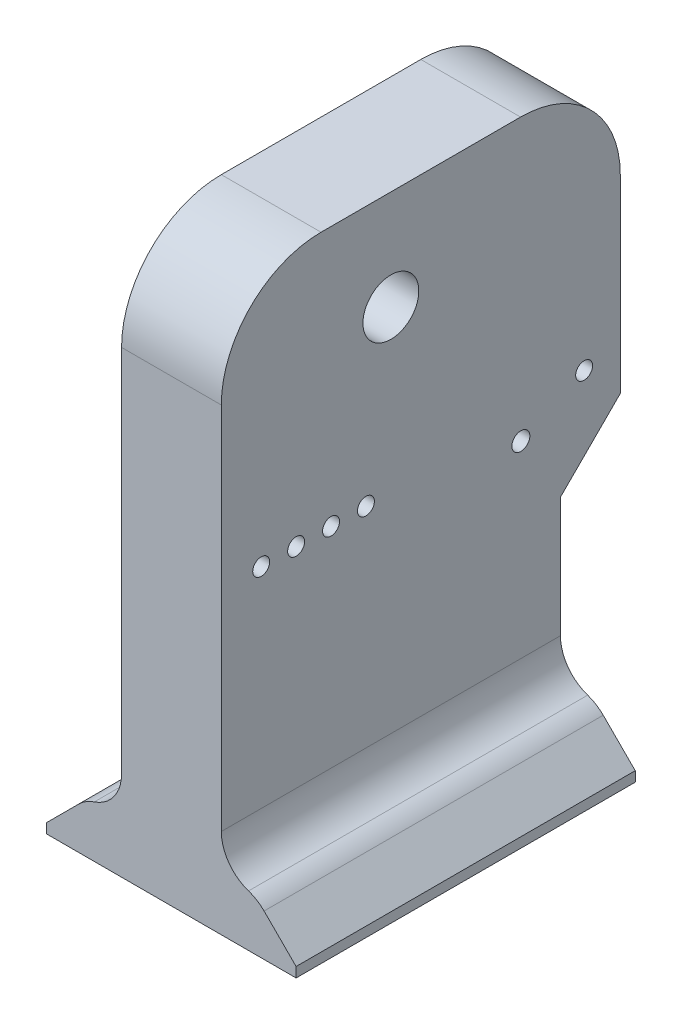
ISO-10303-21;
HEADER;
FILE_DESCRIPTION(('STEP AP214'),'2;1');
FILE_NAME('part.step','',(''),(''),'','','');
FILE_SCHEMA(('AUTOMOTIVE_DESIGN { 1 0 10303 214 1 1 1 1 }'));
ENDSEC;
DATA;
#1=APPLICATION_CONTEXT('core data for automotive mechanical design processes');
#2=APPLICATION_PROTOCOL_DEFINITION('international standard','automotive_design',2000,#1);
#3=PRODUCT_CONTEXT('',#1,'mechanical');
#4=PRODUCT('Part','Part','',(#3));
#5=PRODUCT_RELATED_PRODUCT_CATEGORY('part','',(#4));
#6=PRODUCT_DEFINITION_FORMATION('','',#4);
#7=PRODUCT_DEFINITION_CONTEXT('part definition',#1,'design');
#8=PRODUCT_DEFINITION('design','',#6,#7);
#9=PRODUCT_DEFINITION_SHAPE('','',#8);
#10=(LENGTH_UNIT() NAMED_UNIT(*) SI_UNIT(.MILLI.,.METRE.));
#11=(NAMED_UNIT(*) PLANE_ANGLE_UNIT() SI_UNIT($,.RADIAN.));
#12=(NAMED_UNIT(*) SI_UNIT($,.STERADIAN.) SOLID_ANGLE_UNIT());
#13=UNCERTAINTY_MEASURE_WITH_UNIT(LENGTH_MEASURE(1.E-05),#10,'distance_accuracy_value','');
#14=(GEOMETRIC_REPRESENTATION_CONTEXT(3) GLOBAL_UNCERTAINTY_ASSIGNED_CONTEXT((#13)) GLOBAL_UNIT_ASSIGNED_CONTEXT((#10,
#11,#12)) REPRESENTATION_CONTEXT('',''));
#15=CARTESIAN_POINT('',(0.,0.,0.));
#16=DIRECTION('',(0.,0.,1.));
#17=DIRECTION('',(1.,0.,0.));
#18=AXIS2_PLACEMENT_3D('',#15,#16,#17);
#19=CARTESIAN_POINT('',(-12.5,5.,-17.));
#20=DIRECTION('',(0.,0.,1.));
#21=DIRECTION('',(1.,0.,0.));
#22=AXIS2_PLACEMENT_3D('',#19,#20,#21);
#23=PLANE('',#22);
#24=DIRECTION('',(0.,-1.,0.));
#25=VECTOR('',#24,1.);
#26=CARTESIAN_POINT('',(-5.,56.,-17.));
#27=LINE('',#26,#25);
#28=CARTESIAN_POINT('',(-5.,20.9999999999999,-17.));
#29=VERTEX_POINT('',#28);
#30=CARTESIAN_POINT('',(-5.,8.96862696659689,-17.));
#31=VERTEX_POINT('',#30);
#32=EDGE_CURVE('E190',#29,#31,#27,.T.);
#33=ORIENTED_EDGE('',*,*,#32,.F.);
#34=DIRECTION('',(1.,0.,0.));
#35=VECTOR('',#34,1.);
#36=CARTESIAN_POINT('',(5.,20.9999999999999,-17.));
#37=LINE('',#36,#35);
#38=CARTESIAN_POINT('',(5.,20.9999999999999,-17.));
#39=VERTEX_POINT('',#38);
#40=EDGE_CURVE('E274',#29,#39,#37,.T.);
#41=ORIENTED_EDGE('',*,*,#40,.T.);
#42=DIRECTION('',(0.,-1.,0.));
#43=VECTOR('',#42,1.);
#44=CARTESIAN_POINT('',(5.,56.,-17.));
#45=LINE('',#44,#43);
#46=CARTESIAN_POINT('',(5.,8.96862696659689,-17.));
#47=VERTEX_POINT('',#46);
#48=EDGE_CURVE('E187',#39,#47,#45,.T.);
#49=ORIENTED_EDGE('',*,*,#48,.T.);
#50=CARTESIAN_POINT('',(9.,8.96862696659689,-17.));
#51=DIRECTION('',(0.,0.,1.));
#52=DIRECTION('',(1.,0.,0.));
#53=AXIS2_PLACEMENT_3D('',#50,#51,#52);
#54=CIRCLE('',#53,4.);
#55=CARTESIAN_POINT('',(7.73043965944839,5.17544669910386,-17.));
#56=VERTEX_POINT('',#55);
#57=EDGE_CURVE('E232',#47,#56,#54,.T.);
#58=ORIENTED_EDGE('',*,*,#57,.T.);
#59=CARTESIAN_POINT('',(6.46087931889677,1.38226643161083,-17.));
#60=DIRECTION('',(0.,0.,1.));
#61=DIRECTION('',(1.,0.,0.));
#62=AXIS2_PLACEMENT_3D('',#59,#60,#61);
#63=CIRCLE('',#62,4.);
#64=CARTESIAN_POINT('',(9.28930644364297,4.21069355635701,-17.));
#65=VERTEX_POINT('',#64);
#66=EDGE_CURVE('E255',#56,#65,#63,.F.);
#67=ORIENTED_EDGE('',*,*,#66,.T.);
#68=DIRECTION('',(-0.707106781186546,0.707106781186549,0.));
#69=VECTOR('',#68,1.);
#70=CARTESIAN_POINT('',(8.49999999999999,5.,-17.));
#71=LINE('',#70,#69);
#72=CARTESIAN_POINT('',(12.5,0.999999999999984,-17.));
#73=VERTEX_POINT('',#72);
#74=EDGE_CURVE('E165',#65,#73,#71,.F.);
#75=ORIENTED_EDGE('',*,*,#74,.T.);
#76=DIRECTION('',(0.,-1.,0.));
#77=VECTOR('',#76,1.);
#78=CARTESIAN_POINT('',(12.5,5.,-17.));
#79=LINE('',#78,#77);
#80=CARTESIAN_POINT('',(12.5,0.,-17.));
#81=VERTEX_POINT('',#80);
#82=EDGE_CURVE('E158',#73,#81,#79,.T.);
#83=ORIENTED_EDGE('',*,*,#82,.T.);
#84=DIRECTION('',(-1.,0.,0.));
#85=VECTOR('',#84,1.);
#86=CARTESIAN_POINT('',(-12.5,0.,-17.));
#87=LINE('',#86,#85);
#88=CARTESIAN_POINT('',(-12.5,0.,-17.));
#89=VERTEX_POINT('',#88);
#90=EDGE_CURVE('E162',#81,#89,#87,.T.);
#91=ORIENTED_EDGE('',*,*,#90,.T.);
#92=DIRECTION('',(0.,-1.,0.));
#93=VECTOR('',#92,1.);
#94=CARTESIAN_POINT('',(-12.5,5.,-17.));
#95=LINE('',#94,#93);
#96=CARTESIAN_POINT('',(-12.5,0.999999999999984,-17.));
#97=VERTEX_POINT('',#96);
#98=EDGE_CURVE('E171',#97,#89,#95,.T.);
#99=ORIENTED_EDGE('',*,*,#98,.F.);
#100=DIRECTION('',(-0.707106781186546,-0.707106781186549,0.));
#101=VECTOR('',#100,1.);
#102=CARTESIAN_POINT('',(-8.50000000000001,5.,-17.));
#103=LINE('',#102,#101);
#104=CARTESIAN_POINT('',(-9.28930644364301,4.210693556357,-17.));
#105=VERTEX_POINT('',#104);
#106=EDGE_CURVE('E170',#97,#105,#103,.F.);
#107=ORIENTED_EDGE('',*,*,#106,.T.);
#108=CARTESIAN_POINT('',(-6.46087931889681,1.38226643161082,-17.));
#109=DIRECTION('',(0.,0.,1.));
#110=DIRECTION('',(1.,0.,0.));
#111=AXIS2_PLACEMENT_3D('',#108,#109,#110);
#112=CIRCLE('',#111,4.);
#113=CARTESIAN_POINT('',(-7.73043965944841,5.17544669910386,-17.));
#114=VERTEX_POINT('',#113);
#115=EDGE_CURVE('E252',#105,#114,#112,.F.);
#116=ORIENTED_EDGE('',*,*,#115,.T.);
#117=CARTESIAN_POINT('',(-9.,8.96862696659689,-17.));
#118=DIRECTION('',(0.,0.,1.));
#119=DIRECTION('',(1.,0.,0.));
#120=AXIS2_PLACEMENT_3D('',#117,#118,#119);
#121=CIRCLE('',#120,4.);
#122=EDGE_CURVE('E244',#114,#31,#121,.T.);
#123=ORIENTED_EDGE('',*,*,#122,.T.);
#124=EDGE_LOOP('',(#33,#41,#49,#58,#67,#75,#83,#91,#99,#107,#116,#123));
#125=FACE_BOUND('',#124,.T.);
#126=ADVANCED_FACE('F40',(#125),#23,.F.);
#127=CARTESIAN_POINT('',(12.5,5.,17.));
#128=DIRECTION('',(-1.,0.,0.));
#129=DIRECTION('',(0.,0.,1.));
#130=AXIS2_PLACEMENT_3D('',#127,#128,#129);
#131=PLANE('',#130);
#132=ORIENTED_EDGE('',*,*,#82,.F.);
#133=DIRECTION('',(0.,0.,1.));
#134=VECTOR('',#133,1.);
#135=CARTESIAN_POINT('',(12.5,0.999999999999984,17.));
#136=LINE('',#135,#134);
#137=CARTESIAN_POINT('',(12.5,0.999999999999984,17.));
#138=VERTEX_POINT('',#137);
#139=EDGE_CURVE('E211',#73,#138,#136,.T.);
#140=ORIENTED_EDGE('',*,*,#139,.T.);
#141=DIRECTION('',(0.,-1.,0.));
#142=VECTOR('',#141,1.);
#143=CARTESIAN_POINT('',(12.5,5.,17.));
#144=LINE('',#143,#142);
#145=CARTESIAN_POINT('',(12.5,0.,17.));
#146=VERTEX_POINT('',#145);
#147=EDGE_CURVE('E184',#138,#146,#144,.T.);
#148=ORIENTED_EDGE('',*,*,#147,.T.);
#149=DIRECTION('',(0.,0.,-1.));
#150=VECTOR('',#149,1.);
#151=CARTESIAN_POINT('',(12.5,0.,17.));
#152=LINE('',#151,#150);
#153=EDGE_CURVE('E177',#146,#81,#152,.T.);
#154=ORIENTED_EDGE('',*,*,#153,.T.);
#155=EDGE_LOOP('',(#132,#140,#148,#154));
#156=FACE_BOUND('',#155,.T.);
#157=ADVANCED_FACE('F182',(#156),#131,.F.);
#158=CARTESIAN_POINT('',(-12.5,5.,17.));
#159=DIRECTION('',(1.,0.,0.));
#160=DIRECTION('',(0.,0.,-1.));
#161=AXIS2_PLACEMENT_3D('',#158,#159,#160);
#162=PLANE('',#161);
#163=DIRECTION('',(0.,-1.,0.));
#164=VECTOR('',#163,1.);
#165=CARTESIAN_POINT('',(-12.5,5.,17.));
#166=LINE('',#165,#164);
#167=CARTESIAN_POINT('',(-12.5,0.999999999999984,17.));
#168=VERTEX_POINT('',#167);
#169=CARTESIAN_POINT('',(-12.5,0.,17.));
#170=VERTEX_POINT('',#169);
#171=EDGE_CURVE('E201',#168,#170,#166,.T.);
#172=ORIENTED_EDGE('',*,*,#171,.F.);
#173=DIRECTION('',(0.,0.,-1.));
#174=VECTOR('',#173,1.);
#175=CARTESIAN_POINT('',(-12.5,0.999999999999984,17.));
#176=LINE('',#175,#174);
#177=EDGE_CURVE('E221',#168,#97,#176,.T.);
#178=ORIENTED_EDGE('',*,*,#177,.T.);
#179=ORIENTED_EDGE('',*,*,#98,.T.);
#180=DIRECTION('',(0.,0.,1.));
#181=VECTOR('',#180,1.);
#182=CARTESIAN_POINT('',(-12.5,0.,17.));
#183=LINE('',#182,#181);
#184=EDGE_CURVE('E179',#89,#170,#183,.T.);
#185=ORIENTED_EDGE('',*,*,#184,.T.);
#186=EDGE_LOOP('',(#172,#178,#179,#185));
#187=FACE_BOUND('',#186,.T.);
#188=ADVANCED_FACE('F432',(#187),#162,.F.);
#189=CARTESIAN_POINT('',(-12.5,5.,17.));
#190=DIRECTION('',(0.,0.,-1.));
#191=DIRECTION('',(-1.,0.,0.));
#192=AXIS2_PLACEMENT_3D('',#189,#190,#191);
#193=PLANE('',#192);
#194=DIRECTION('',(0.,-1.,0.));
#195=VECTOR('',#194,1.);
#196=CARTESIAN_POINT('',(5.,56.,17.));
#197=LINE('',#196,#195);
#198=CARTESIAN_POINT('',(5.,46.,17.));
#199=VERTEX_POINT('',#198);
#200=CARTESIAN_POINT('',(5.,8.96862696659689,17.));
#201=VERTEX_POINT('',#200);
#202=EDGE_CURVE('E379',#199,#201,#197,.T.);
#203=ORIENTED_EDGE('',*,*,#202,.F.);
#204=DIRECTION('',(1.,0.,0.));
#205=VECTOR('',#204,1.);
#206=CARTESIAN_POINT('',(-12.5,46.,17.));
#207=LINE('',#206,#205);
#208=CARTESIAN_POINT('',(-5.,46.,17.));
#209=VERTEX_POINT('',#208);
#210=EDGE_CURVE('E66',#199,#209,#207,.F.);
#211=ORIENTED_EDGE('',*,*,#210,.T.);
#212=DIRECTION('',(0.,-1.,0.));
#213=VECTOR('',#212,1.);
#214=CARTESIAN_POINT('',(-5.,56.,17.));
#215=LINE('',#214,#213);
#216=CARTESIAN_POINT('',(-5.,8.96862696659689,17.));
#217=VERTEX_POINT('',#216);
#218=EDGE_CURVE('E382',#209,#217,#215,.T.);
#219=ORIENTED_EDGE('',*,*,#218,.T.);
#220=CARTESIAN_POINT('',(-9.,8.96862696659689,17.));
#221=DIRECTION('',(0.,0.,-1.));
#222=DIRECTION('',(-1.,0.,0.));
#223=AXIS2_PLACEMENT_3D('',#220,#221,#222);
#224=CIRCLE('',#223,4.);
#225=CARTESIAN_POINT('',(-7.73043965944841,5.17544669910386,17.));
#226=VERTEX_POINT('',#225);
#227=EDGE_CURVE('E240',#217,#226,#224,.T.);
#228=ORIENTED_EDGE('',*,*,#227,.T.);
#229=CARTESIAN_POINT('',(-6.46087931889681,1.38226643161082,17.));
#230=DIRECTION('',(0.,0.,-1.));
#231=DIRECTION('',(-1.,0.,0.));
#232=AXIS2_PLACEMENT_3D('',#229,#230,#231);
#233=CIRCLE('',#232,4.);
#234=CARTESIAN_POINT('',(-9.28930644364301,4.210693556357,17.));
#235=VERTEX_POINT('',#234);
#236=EDGE_CURVE('E261',#226,#235,#233,.F.);
#237=ORIENTED_EDGE('',*,*,#236,.T.);
#238=DIRECTION('',(0.707106781186546,0.707106781186549,0.));
#239=VECTOR('',#238,1.);
#240=CARTESIAN_POINT('',(-8.50000000000001,5.,17.));
#241=LINE('',#240,#239);
#242=EDGE_CURVE('E214',#235,#168,#241,.F.);
#243=ORIENTED_EDGE('',*,*,#242,.T.);
#244=ORIENTED_EDGE('',*,*,#171,.T.);
#245=DIRECTION('',(1.,0.,0.));
#246=VECTOR('',#245,1.);
#247=CARTESIAN_POINT('',(-12.5,0.,17.));
#248=LINE('',#247,#246);
#249=EDGE_CURVE('E196',#170,#146,#248,.T.);
#250=ORIENTED_EDGE('',*,*,#249,.T.);
#251=ORIENTED_EDGE('',*,*,#147,.F.);
#252=DIRECTION('',(0.707106781186546,-0.707106781186549,0.));
#253=VECTOR('',#252,1.);
#254=CARTESIAN_POINT('',(8.49999999999999,5.,17.));
#255=LINE('',#254,#253);
#256=CARTESIAN_POINT('',(9.28930644364297,4.21069355635701,17.));
#257=VERTEX_POINT('',#256);
#258=EDGE_CURVE('E217',#138,#257,#255,.F.);
#259=ORIENTED_EDGE('',*,*,#258,.T.);
#260=CARTESIAN_POINT('',(6.46087931889677,1.38226643161083,17.));
#261=DIRECTION('',(0.,0.,-1.));
#262=DIRECTION('',(-1.,0.,0.));
#263=AXIS2_PLACEMENT_3D('',#260,#261,#262);
#264=CIRCLE('',#263,4.);
#265=CARTESIAN_POINT('',(7.73043965944839,5.17544669910386,17.));
#266=VERTEX_POINT('',#265);
#267=EDGE_CURVE('E264',#257,#266,#264,.F.);
#268=ORIENTED_EDGE('',*,*,#267,.T.);
#269=CARTESIAN_POINT('',(9.,8.96862696659689,17.));
#270=DIRECTION('',(0.,0.,-1.));
#271=DIRECTION('',(-1.,0.,0.));
#272=AXIS2_PLACEMENT_3D('',#269,#270,#271);
#273=CIRCLE('',#272,4.);
#274=EDGE_CURVE('E236',#266,#201,#273,.T.);
#275=ORIENTED_EDGE('',*,*,#274,.T.);
#276=EDGE_LOOP('',(#203,#211,#219,#228,#237,#243,#244,#250,#251,#259,#268,#275));
#277=FACE_BOUND('',#276,.T.);
#278=ADVANCED_FACE('F395',(#277),#193,.F.);
#279=CARTESIAN_POINT('',(0.,0.,0.));
#280=DIRECTION('',(0.,-1.,0.));
#281=DIRECTION('',(0.,0.,-1.));
#282=AXIS2_PLACEMENT_3D('',#279,#280,#281);
#283=PLANE('',#282);
#284=ORIENTED_EDGE('',*,*,#153,.F.);
#285=ORIENTED_EDGE('',*,*,#249,.F.);
#286=ORIENTED_EDGE('',*,*,#184,.F.);
#287=ORIENTED_EDGE('',*,*,#90,.F.);
#288=EDGE_LOOP('',(#284,#285,#286,#287));
#289=FACE_BOUND('',#288,.T.);
#290=ADVANCED_FACE('F175',(#289),#283,.T.);
#291=CARTESIAN_POINT('',(5.,56.,17.));
#292=DIRECTION('',(-1.,0.,0.));
#293=DIRECTION('',(0.,0.,1.));
#294=AXIS2_PLACEMENT_3D('',#291,#292,#293);
#295=PLANE('',#294);
#296=CARTESIAN_POINT('',(5.,27.8511991208521,-13.0306143425969));
#297=DIRECTION('',(1.,0.,0.));
#298=DIRECTION('',(0.,0.,-1.));
#299=AXIS2_PLACEMENT_3D('',#296,#297,#298);
#300=CIRCLE('',#299,0.900000000000001);
#301=CARTESIAN_POINT('',(5.,27.8511991208521,-13.9306143425969));
#302=VERTEX_POINT('',#301);
#303=EDGE_CURVE('E310',#302,#302,#300,.T.);
#304=ORIENTED_EDGE('',*,*,#303,.F.);
#305=EDGE_LOOP('',(#304));
#306=FACE_BOUND('',#305,.T.);
#307=CARTESIAN_POINT('',(5.,30.809526953037,-19.3747688518534));
#308=DIRECTION('',(1.,0.,0.));
#309=DIRECTION('',(0.,0.,-1.));
#310=AXIS2_PLACEMENT_3D('',#307,#308,#309);
#311=CIRCLE('',#310,0.85);
#312=CARTESIAN_POINT('',(5.,30.809526953037,-20.2247688518534));
#313=VERTEX_POINT('',#312);
#314=EDGE_CURVE('E318',#313,#313,#311,.T.);
#315=ORIENTED_EDGE('',*,*,#314,.F.);
#316=EDGE_LOOP('',(#315));
#317=FACE_BOUND('',#316,.T.);
#318=CARTESIAN_POINT('',(5.,29.9686269665969,13.));
#319=DIRECTION('',(-1.,0.,0.));
#320=DIRECTION('',(0.,0.,1.));
#321=AXIS2_PLACEMENT_3D('',#318,#319,#320);
#322=CIRCLE('',#321,0.850000000000001);
#323=CARTESIAN_POINT('',(5.,29.9686269665969,13.85));
#324=VERTEX_POINT('',#323);
#325=EDGE_CURVE('E359',#324,#324,#322,.T.);
#326=ORIENTED_EDGE('',*,*,#325,.T.);
#327=EDGE_LOOP('',(#326));
#328=FACE_BOUND('',#327,.T.);
#329=CARTESIAN_POINT('',(5.,29.9686269665969,2.5));
#330=DIRECTION('',(-1.,0.,0.));
#331=DIRECTION('',(0.,0.,1.));
#332=AXIS2_PLACEMENT_3D('',#329,#330,#331);
#333=CIRCLE('',#332,0.85);
#334=CARTESIAN_POINT('',(5.,29.9686269665969,3.34999999999999));
#335=VERTEX_POINT('',#334);
#336=EDGE_CURVE('E355',#335,#335,#333,.T.);
#337=ORIENTED_EDGE('',*,*,#336,.T.);
#338=EDGE_LOOP('',(#337));
#339=FACE_BOUND('',#338,.T.);
#340=CARTESIAN_POINT('',(5.,29.9686269665969,9.49999999999999));
#341=DIRECTION('',(-1.,0.,0.));
#342=DIRECTION('',(0.,0.,1.));
#343=AXIS2_PLACEMENT_3D('',#340,#341,#342);
#344=CIRCLE('',#343,0.850000000000003);
#345=CARTESIAN_POINT('',(5.,29.9686269665969,10.35));
#346=VERTEX_POINT('',#345);
#347=EDGE_CURVE('E351',#346,#346,#344,.T.);
#348=ORIENTED_EDGE('',*,*,#347,.T.);
#349=EDGE_LOOP('',(#348));
#350=FACE_BOUND('',#349,.T.);
#351=CARTESIAN_POINT('',(5.,29.9686269665969,5.99999999999999));
#352=DIRECTION('',(-1.,0.,0.));
#353=DIRECTION('',(0.,0.,1.));
#354=AXIS2_PLACEMENT_3D('',#351,#352,#353);
#355=CIRCLE('',#354,0.85);
#356=CARTESIAN_POINT('',(5.,29.9686269665969,6.84999999999999));
#357=VERTEX_POINT('',#356);
#358=EDGE_CURVE('E347',#357,#357,#355,.T.);
#359=ORIENTED_EDGE('',*,*,#358,.T.);
#360=EDGE_LOOP('',(#359));
#361=FACE_BOUND('',#360,.T.);
#362=CARTESIAN_POINT('',(5.,46.,0.));
#363=DIRECTION('',(-1.,0.,0.));
#364=DIRECTION('',(0.,0.,1.));
#365=AXIS2_PLACEMENT_3D('',#362,#363,#364);
#366=CIRCLE('',#365,2.8);
#367=CARTESIAN_POINT('',(5.,46.,2.8));
#368=VERTEX_POINT('',#367);
#369=EDGE_CURVE('E367',#368,#368,#366,.T.);
#370=ORIENTED_EDGE('',*,*,#369,.T.);
#371=EDGE_LOOP('',(#370));
#372=FACE_BOUND('',#371,.T.);
#373=DIRECTION('',(0.,0.,-1.));
#374=VECTOR('',#373,1.);
#375=CARTESIAN_POINT('',(5.,56.,17.));
#376=LINE('',#375,#374);
#377=CARTESIAN_POINT('',(5.,56.,7.));
#378=VERTEX_POINT('',#377);
#379=CARTESIAN_POINT('',(5.,56.,-13.));
#380=VERTEX_POINT('',#379);
#381=EDGE_CURVE('E371',#378,#380,#376,.T.);
#382=ORIENTED_EDGE('',*,*,#381,.F.);
#383=CARTESIAN_POINT('',(5.,46.,7.));
#384=DIRECTION('',(-1.,0.,0.));
#385=DIRECTION('',(0.,0.,1.));
#386=AXIS2_PLACEMENT_3D('',#383,#384,#385);
#387=CIRCLE('',#386,10.);
#388=EDGE_CURVE('E299',#378,#199,#387,.F.);
#389=ORIENTED_EDGE('',*,*,#388,.T.);
#390=ORIENTED_EDGE('',*,*,#202,.T.);
#391=DIRECTION('',(0.,0.,-1.));
#392=VECTOR('',#391,1.);
#393=CARTESIAN_POINT('',(5.,8.96862696659689,17.));
#394=LINE('',#393,#392);
#395=EDGE_CURVE('E224',#201,#47,#394,.T.);
#396=ORIENTED_EDGE('',*,*,#395,.T.);
#397=ORIENTED_EDGE('',*,*,#48,.F.);
#398=DIRECTION('',(0.,-0.707106781186544,0.707106781186551));
#399=VECTOR('',#398,1.);
#400=CARTESIAN_POINT('',(5.,21.4999999999998,-17.4999999999999));
#401=LINE('',#400,#399);
#402=CARTESIAN_POINT('',(5.,26.9999999999998,-23.));
#403=VERTEX_POINT('',#402);
#404=EDGE_CURVE('E285',#39,#403,#401,.F.);
#405=ORIENTED_EDGE('',*,*,#404,.T.);
#406=DIRECTION('',(0.,-1.,0.));
#407=VECTOR('',#406,1.);
#408=CARTESIAN_POINT('',(5.,56.,-23.));
#409=LINE('',#408,#407);
#410=CARTESIAN_POINT('',(5.,46.,-23.));
#411=VERTEX_POINT('',#410);
#412=EDGE_CURVE('E316',#411,#403,#409,.T.);
#413=ORIENTED_EDGE('',*,*,#412,.F.);
#414=CARTESIAN_POINT('',(5.,46.,-13.));
#415=DIRECTION('',(-1.,0.,0.));
#416=DIRECTION('',(0.,0.,1.));
#417=AXIS2_PLACEMENT_3D('',#414,#415,#416);
#418=CIRCLE('',#417,10.);
#419=EDGE_CURVE('E296',#411,#380,#418,.F.);
#420=ORIENTED_EDGE('',*,*,#419,.T.);
#421=EDGE_LOOP('',(#382,#389,#390,#396,#397,#405,#413,#420));
#422=FACE_BOUND('',#421,.T.);
#423=ADVANCED_FACE('F406',(#306,#317,#328,#339,#350,#361,#372,#422),#295,.F.);
#424=CARTESIAN_POINT('',(-5.,56.,17.));
#425=DIRECTION('',(1.,0.,0.));
#426=DIRECTION('',(0.,0.,-1.));
#427=AXIS2_PLACEMENT_3D('',#424,#425,#426);
#428=PLANE('',#427);
#429=CARTESIAN_POINT('',(-5.,27.8511991208521,-13.0306143425969));
#430=DIRECTION('',(1.,0.,0.));
#431=DIRECTION('',(0.,0.,-1.));
#432=AXIS2_PLACEMENT_3D('',#429,#430,#431);
#433=CIRCLE('',#432,0.900000000000001);
#434=CARTESIAN_POINT('',(-5.,27.8511991208521,-13.9306143425969));
#435=VERTEX_POINT('',#434);
#436=EDGE_CURVE('E44',#435,#435,#433,.T.);
#437=ORIENTED_EDGE('',*,*,#436,.T.);
#438=EDGE_LOOP('',(#437));
#439=FACE_BOUND('',#438,.T.);
#440=CARTESIAN_POINT('',(-5.,30.809526953037,-19.3747688518534));
#441=DIRECTION('',(1.,0.,0.));
#442=DIRECTION('',(0.,0.,-1.));
#443=AXIS2_PLACEMENT_3D('',#440,#441,#442);
#444=CIRCLE('',#443,0.85);
#445=CARTESIAN_POINT('',(-5.,30.809526953037,-20.2247688518534));
#446=VERTEX_POINT('',#445);
#447=EDGE_CURVE('E307',#446,#446,#444,.T.);
#448=ORIENTED_EDGE('',*,*,#447,.T.);
#449=EDGE_LOOP('',(#448));
#450=FACE_BOUND('',#449,.T.);
#451=CARTESIAN_POINT('',(-5.,29.9686269665969,13.));
#452=DIRECTION('',(-1.,0.,0.));
#453=DIRECTION('',(0.,0.,1.));
#454=AXIS2_PLACEMENT_3D('',#451,#452,#453);
#455=CIRCLE('',#454,0.850000000000001);
#456=CARTESIAN_POINT('',(-5.,29.9686269665969,13.85));
#457=VERTEX_POINT('',#456);
#458=EDGE_CURVE('E336',#457,#457,#455,.T.);
#459=ORIENTED_EDGE('',*,*,#458,.F.);
#460=EDGE_LOOP('',(#459));
#461=FACE_BOUND('',#460,.T.);
#462=CARTESIAN_POINT('',(-5.,29.9686269665969,2.5));
#463=DIRECTION('',(-1.,0.,0.));
#464=DIRECTION('',(0.,0.,1.));
#465=AXIS2_PLACEMENT_3D('',#462,#463,#464);
#466=CIRCLE('',#465,0.85);
#467=CARTESIAN_POINT('',(-5.,29.9686269665969,3.34999999999999));
#468=VERTEX_POINT('',#467);
#469=EDGE_CURVE('E335',#468,#468,#466,.T.);
#470=ORIENTED_EDGE('',*,*,#469,.F.);
#471=EDGE_LOOP('',(#470));
#472=FACE_BOUND('',#471,.T.);
#473=CARTESIAN_POINT('',(-5.,29.9686269665969,9.49999999999999));
#474=DIRECTION('',(-1.,0.,0.));
#475=DIRECTION('',(0.,0.,1.));
#476=AXIS2_PLACEMENT_3D('',#473,#474,#475);
#477=CIRCLE('',#476,0.850000000000003);
#478=CARTESIAN_POINT('',(-5.,29.9686269665969,10.35));
#479=VERTEX_POINT('',#478);
#480=EDGE_CURVE('E331',#479,#479,#477,.T.);
#481=ORIENTED_EDGE('',*,*,#480,.F.);
#482=EDGE_LOOP('',(#481));
#483=FACE_BOUND('',#482,.T.);
#484=CARTESIAN_POINT('',(-5.,29.9686269665969,5.99999999999999));
#485=DIRECTION('',(-1.,0.,0.));
#486=DIRECTION('',(0.,0.,1.));
#487=AXIS2_PLACEMENT_3D('',#484,#485,#486);
#488=CIRCLE('',#487,0.85);
#489=CARTESIAN_POINT('',(-5.,29.9686269665969,6.84999999999999));
#490=VERTEX_POINT('',#489);
#491=EDGE_CURVE('E340',#490,#490,#488,.T.);
#492=ORIENTED_EDGE('',*,*,#491,.F.);
#493=EDGE_LOOP('',(#492));
#494=FACE_BOUND('',#493,.T.);
#495=CARTESIAN_POINT('',(-5.,46.,0.));
#496=DIRECTION('',(-1.,0.,0.));
#497=DIRECTION('',(0.,0.,1.));
#498=AXIS2_PLACEMENT_3D('',#495,#496,#497);
#499=CIRCLE('',#498,2.8);
#500=CARTESIAN_POINT('',(-5.,46.,2.8));
#501=VERTEX_POINT('',#500);
#502=EDGE_CURVE('E363',#501,#501,#499,.T.);
#503=ORIENTED_EDGE('',*,*,#502,.F.);
#504=EDGE_LOOP('',(#503));
#505=FACE_BOUND('',#504,.T.);
#506=ORIENTED_EDGE('',*,*,#218,.F.);
#507=CARTESIAN_POINT('',(-5.,46.,7.));
#508=DIRECTION('',(1.,0.,0.));
#509=DIRECTION('',(0.,0.,-1.));
#510=AXIS2_PLACEMENT_3D('',#507,#508,#509);
#511=CIRCLE('',#510,10.);
#512=CARTESIAN_POINT('',(-5.,56.,7.));
#513=VERTEX_POINT('',#512);
#514=EDGE_CURVE('E50',#209,#513,#511,.F.);
#515=ORIENTED_EDGE('',*,*,#514,.T.);
#516=DIRECTION('',(0.,0.,1.));
#517=VECTOR('',#516,1.);
#518=CARTESIAN_POINT('',(-5.,56.,17.));
#519=LINE('',#518,#517);
#520=CARTESIAN_POINT('',(-5.,56.,-13.));
#521=VERTEX_POINT('',#520);
#522=EDGE_CURVE('E375',#521,#513,#519,.T.);
#523=ORIENTED_EDGE('',*,*,#522,.F.);
#524=CARTESIAN_POINT('',(-5.,46.,-13.));
#525=DIRECTION('',(1.,0.,0.));
#526=DIRECTION('',(0.,0.,-1.));
#527=AXIS2_PLACEMENT_3D('',#524,#525,#526);
#528=CIRCLE('',#527,10.);
#529=CARTESIAN_POINT('',(-5.,46.,-23.));
#530=VERTEX_POINT('',#529);
#531=EDGE_CURVE('E58',#521,#530,#528,.F.);
#532=ORIENTED_EDGE('',*,*,#531,.T.);
#533=DIRECTION('',(0.,1.,0.));
#534=VECTOR('',#533,1.);
#535=CARTESIAN_POINT('',(-5.,56.,-23.));
#536=LINE('',#535,#534);
#537=CARTESIAN_POINT('',(-5.,26.9999999999998,-23.));
#538=VERTEX_POINT('',#537);
#539=EDGE_CURVE('E328',#538,#530,#536,.T.);
#540=ORIENTED_EDGE('',*,*,#539,.F.);
#541=DIRECTION('',(0.,0.707106781186544,-0.707106781186551));
#542=VECTOR('',#541,1.);
#543=CARTESIAN_POINT('',(-5.,21.4999999999998,-17.4999999999999));
#544=LINE('',#543,#542);
#545=EDGE_CURVE('E282',#538,#29,#544,.F.);
#546=ORIENTED_EDGE('',*,*,#545,.T.);
#547=ORIENTED_EDGE('',*,*,#32,.T.);
#548=DIRECTION('',(0.,0.,1.));
#549=VECTOR('',#548,1.);
#550=CARTESIAN_POINT('',(-5.,8.96862696659689,17.));
#551=LINE('',#550,#549);
#552=EDGE_CURVE('E228',#31,#217,#551,.T.);
#553=ORIENTED_EDGE('',*,*,#552,.T.);
#554=EDGE_LOOP('',(#506,#515,#523,#532,#540,#546,#547,#553));
#555=FACE_BOUND('',#554,.T.);
#556=ADVANCED_FACE('F385',(#439,#450,#461,#472,#483,#494,#505,#555),#428,.F.);
#557=CARTESIAN_POINT('',(0.,56.,0.));
#558=DIRECTION('',(0.,-1.,0.));
#559=DIRECTION('',(0.,0.,-1.));
#560=AXIS2_PLACEMENT_3D('',#557,#558,#559);
#561=PLANE('',#560);
#562=ORIENTED_EDGE('',*,*,#522,.T.);
#563=DIRECTION('',(1.,0.,0.));
#564=VECTOR('',#563,1.);
#565=CARTESIAN_POINT('',(0.,56.,7.));
#566=LINE('',#565,#564);
#567=EDGE_CURVE('E292',#513,#378,#566,.T.);
#568=ORIENTED_EDGE('',*,*,#567,.T.);
#569=ORIENTED_EDGE('',*,*,#381,.T.);
#570=DIRECTION('',(1.,0.,0.));
#571=VECTOR('',#570,1.);
#572=CARTESIAN_POINT('',(-5.,56.,-13.));
#573=LINE('',#572,#571);
#574=EDGE_CURVE('E289',#380,#521,#573,.F.);
#575=ORIENTED_EDGE('',*,*,#574,.T.);
#576=EDGE_LOOP('',(#562,#568,#569,#575));
#577=FACE_BOUND('',#576,.T.);
#578=ADVANCED_FACE('F403',(#577),#561,.F.);
#579=CARTESIAN_POINT('',(36.,46.,0.));
#580=DIRECTION('',(-1.,0.,0.));
#581=DIRECTION('',(0.,0.,1.));
#582=AXIS2_PLACEMENT_3D('',#579,#580,#581);
#583=CYLINDRICAL_SURFACE('',#582,2.8);
#584=ORIENTED_EDGE('',*,*,#502,.T.);
#585=EDGE_LOOP('',(#584));
#586=FACE_BOUND('',#585,.T.);
#587=ORIENTED_EDGE('',*,*,#369,.F.);
#588=EDGE_LOOP('',(#587));
#589=FACE_BOUND('',#588,.T.);
#590=ADVANCED_FACE('F466',(#586,#589),#583,.F.);
#591=CARTESIAN_POINT('',(8.49999999999999,5.,0.));
#592=DIRECTION('',(-0.707106781186549,-0.707106781186546,0.));
#593=DIRECTION('',(0.,0.,-1.));
#594=AXIS2_PLACEMENT_3D('',#591,#592,#593);
#595=PLANE('',#594);
#596=ORIENTED_EDGE('',*,*,#74,.F.);
#597=DIRECTION('',(0.,0.,-1.));
#598=VECTOR('',#597,1.);
#599=CARTESIAN_POINT('',(9.28930644364297,4.21069355635701,17.));
#600=LINE('',#599,#598);
#601=EDGE_CURVE('E258',#65,#257,#600,.F.);
#602=ORIENTED_EDGE('',*,*,#601,.T.);
#603=ORIENTED_EDGE('',*,*,#258,.F.);
#604=ORIENTED_EDGE('',*,*,#139,.F.);
#605=EDGE_LOOP('',(#596,#602,#603,#604));
#606=FACE_BOUND('',#605,.T.);
#607=ADVANCED_FACE('F425',(#606),#595,.F.);
#608=CARTESIAN_POINT('',(-8.50000000000001,5.,0.));
#609=DIRECTION('',(0.707106781186549,-0.707106781186546,0.));
#610=DIRECTION('',(0.,0.,1.));
#611=AXIS2_PLACEMENT_3D('',#608,#609,#610);
#612=PLANE('',#611);
#613=ORIENTED_EDGE('',*,*,#242,.F.);
#614=DIRECTION('',(0.,0.,1.));
#615=VECTOR('',#614,1.);
#616=CARTESIAN_POINT('',(-9.28930644364301,4.210693556357,-17.));
#617=LINE('',#616,#615);
#618=EDGE_CURVE('E271',#235,#105,#617,.F.);
#619=ORIENTED_EDGE('',*,*,#618,.T.);
#620=ORIENTED_EDGE('',*,*,#106,.F.);
#621=ORIENTED_EDGE('',*,*,#177,.F.);
#622=EDGE_LOOP('',(#613,#619,#620,#621));
#623=FACE_BOUND('',#622,.T.);
#624=ADVANCED_FACE('F435',(#623),#612,.F.);
#625=CARTESIAN_POINT('',(9.,8.96862696659689,0.));
#626=DIRECTION('',(0.,0.,-1.));
#627=DIRECTION('',(-1.,0.,0.));
#628=AXIS2_PLACEMENT_3D('',#625,#626,#627);
#629=CYLINDRICAL_SURFACE('',#628,4.);
#630=ORIENTED_EDGE('',*,*,#274,.F.);
#631=DIRECTION('',(0.,0.,-1.));
#632=VECTOR('',#631,1.);
#633=CARTESIAN_POINT('',(7.73043965944839,5.17544669910386,0.));
#634=LINE('',#633,#632);
#635=EDGE_CURVE('E248',#266,#56,#634,.T.);
#636=ORIENTED_EDGE('',*,*,#635,.T.);
#637=ORIENTED_EDGE('',*,*,#57,.F.);
#638=ORIENTED_EDGE('',*,*,#395,.F.);
#639=EDGE_LOOP('',(#630,#636,#637,#638));
#640=FACE_BOUND('',#639,.T.);
#641=ADVANCED_FACE('F420',(#640),#629,.F.);
#642=CARTESIAN_POINT('',(-9.,8.96862696659689,0.));
#643=DIRECTION('',(0.,0.,1.));
#644=DIRECTION('',(1.,0.,0.));
#645=AXIS2_PLACEMENT_3D('',#642,#643,#644);
#646=CYLINDRICAL_SURFACE('',#645,4.);
#647=ORIENTED_EDGE('',*,*,#122,.F.);
#648=DIRECTION('',(0.,0.,1.));
#649=VECTOR('',#648,1.);
#650=CARTESIAN_POINT('',(-7.73043965944841,5.17544669910386,0.));
#651=LINE('',#650,#649);
#652=EDGE_CURVE('E267',#114,#226,#651,.T.);
#653=ORIENTED_EDGE('',*,*,#652,.T.);
#654=ORIENTED_EDGE('',*,*,#227,.F.);
#655=ORIENTED_EDGE('',*,*,#552,.F.);
#656=EDGE_LOOP('',(#647,#653,#654,#655));
#657=FACE_BOUND('',#656,.T.);
#658=ADVANCED_FACE('F394',(#657),#646,.F.);
#659=CARTESIAN_POINT('',(6.46087931889677,1.38226643161083,0.));
#660=DIRECTION('',(0.,0.,-1.));
#661=DIRECTION('',(-1.,0.,0.));
#662=AXIS2_PLACEMENT_3D('',#659,#660,#661);
#663=CYLINDRICAL_SURFACE('',#662,4.);
#664=ORIENTED_EDGE('',*,*,#267,.F.);
#665=ORIENTED_EDGE('',*,*,#601,.F.);
#666=ORIENTED_EDGE('',*,*,#66,.F.);
#667=ORIENTED_EDGE('',*,*,#635,.F.);
#668=EDGE_LOOP('',(#664,#665,#666,#667));
#669=FACE_BOUND('',#668,.T.);
#670=ADVANCED_FACE('F428',(#669),#663,.T.);
#671=CARTESIAN_POINT('',(-6.46087931889681,1.38226643161082,0.));
#672=DIRECTION('',(0.,0.,1.));
#673=DIRECTION('',(1.,0.,0.));
#674=AXIS2_PLACEMENT_3D('',#671,#672,#673);
#675=CYLINDRICAL_SURFACE('',#674,4.);
#676=ORIENTED_EDGE('',*,*,#115,.F.);
#677=ORIENTED_EDGE('',*,*,#618,.F.);
#678=ORIENTED_EDGE('',*,*,#236,.F.);
#679=ORIENTED_EDGE('',*,*,#652,.F.);
#680=EDGE_LOOP('',(#676,#677,#678,#679));
#681=FACE_BOUND('',#680,.T.);
#682=ADVANCED_FACE('F438',(#681),#675,.T.);
#683=CARTESIAN_POINT('',(36.,29.9686269665969,5.99999999999999));
#684=DIRECTION('',(-1.,0.,0.));
#685=DIRECTION('',(0.,0.,1.));
#686=AXIS2_PLACEMENT_3D('',#683,#684,#685);
#687=CYLINDRICAL_SURFACE('',#686,0.85);
#688=ORIENTED_EDGE('',*,*,#491,.T.);
#689=EDGE_LOOP('',(#688));
#690=FACE_BOUND('',#689,.T.);
#691=ORIENTED_EDGE('',*,*,#358,.F.);
#692=EDGE_LOOP('',(#691));
#693=FACE_BOUND('',#692,.T.);
#694=ADVANCED_FACE('F440',(#690,#693),#687,.F.);
#695=CARTESIAN_POINT('',(36.,29.9686269665969,9.49999999999999));
#696=DIRECTION('',(-1.,0.,0.));
#697=DIRECTION('',(0.,0.,1.));
#698=AXIS2_PLACEMENT_3D('',#695,#696,#697);
#699=CYLINDRICAL_SURFACE('',#698,0.850000000000003);
#700=ORIENTED_EDGE('',*,*,#480,.T.);
#701=EDGE_LOOP('',(#700));
#702=FACE_BOUND('',#701,.T.);
#703=ORIENTED_EDGE('',*,*,#347,.F.);
#704=EDGE_LOOP('',(#703));
#705=FACE_BOUND('',#704,.T.);
#706=ADVANCED_FACE('F446',(#702,#705),#699,.F.);
#707=CARTESIAN_POINT('',(36.,29.9686269665969,2.5));
#708=DIRECTION('',(-1.,0.,0.));
#709=DIRECTION('',(0.,0.,1.));
#710=AXIS2_PLACEMENT_3D('',#707,#708,#709);
#711=CYLINDRICAL_SURFACE('',#710,0.85);
#712=ORIENTED_EDGE('',*,*,#469,.T.);
#713=EDGE_LOOP('',(#712));
#714=FACE_BOUND('',#713,.T.);
#715=ORIENTED_EDGE('',*,*,#336,.F.);
#716=EDGE_LOOP('',(#715));
#717=FACE_BOUND('',#716,.T.);
#718=ADVANCED_FACE('F502',(#714,#717),#711,.F.);
#719=CARTESIAN_POINT('',(36.,29.9686269665969,13.));
#720=DIRECTION('',(-1.,0.,0.));
#721=DIRECTION('',(0.,0.,1.));
#722=AXIS2_PLACEMENT_3D('',#719,#720,#721);
#723=CYLINDRICAL_SURFACE('',#722,0.850000000000001);
#724=ORIENTED_EDGE('',*,*,#458,.T.);
#725=EDGE_LOOP('',(#724));
#726=FACE_BOUND('',#725,.T.);
#727=ORIENTED_EDGE('',*,*,#325,.F.);
#728=EDGE_LOOP('',(#727));
#729=FACE_BOUND('',#728,.T.);
#730=ADVANCED_FACE('F512',(#726,#729),#723,.F.);
#731=CARTESIAN_POINT('',(0.,0.,-23.));
#732=DIRECTION('',(0.,0.,-1.));
#733=DIRECTION('',(-1.,0.,0.));
#734=AXIS2_PLACEMENT_3D('',#731,#732,#733);
#735=PLANE('',#734);
#736=ORIENTED_EDGE('',*,*,#539,.T.);
#737=DIRECTION('',(1.,0.,0.));
#738=VECTOR('',#737,1.);
#739=CARTESIAN_POINT('',(5.,46.,-23.));
#740=LINE('',#739,#738);
#741=EDGE_CURVE('E11',#530,#411,#740,.T.);
#742=ORIENTED_EDGE('',*,*,#741,.T.);
#743=ORIENTED_EDGE('',*,*,#412,.T.);
#744=DIRECTION('',(1.,0.,0.));
#745=VECTOR('',#744,1.);
#746=CARTESIAN_POINT('',(5.,26.9999999999998,-23.));
#747=LINE('',#746,#745);
#748=EDGE_CURVE('E278',#403,#538,#747,.F.);
#749=ORIENTED_EDGE('',*,*,#748,.T.);
#750=EDGE_LOOP('',(#736,#742,#743,#749));
#751=FACE_BOUND('',#750,.T.);
#752=ADVANCED_FACE('F411',(#751),#735,.T.);
#753=CARTESIAN_POINT('',(5.,36.,-32.0000000000003));
#754=DIRECTION('',(0.,-0.707106781186551,-0.707106781186544));
#755=DIRECTION('',(1.,0.,0.));
#756=AXIS2_PLACEMENT_3D('',#753,#754,#755);
#757=PLANE('',#756);
#758=ORIENTED_EDGE('',*,*,#404,.F.);
#759=ORIENTED_EDGE('',*,*,#40,.F.);
#760=ORIENTED_EDGE('',*,*,#545,.F.);
#761=ORIENTED_EDGE('',*,*,#748,.F.);
#762=EDGE_LOOP('',(#758,#759,#760,#761));
#763=FACE_BOUND('',#762,.T.);
#764=ADVANCED_FACE('F414',(#763),#757,.T.);
#765=CARTESIAN_POINT('',(0.,46.,7.));
#766=DIRECTION('',(1.,0.,0.));
#767=DIRECTION('',(0.,0.,-1.));
#768=AXIS2_PLACEMENT_3D('',#765,#766,#767);
#769=CYLINDRICAL_SURFACE('',#768,10.);
#770=ORIENTED_EDGE('',*,*,#514,.F.);
#771=ORIENTED_EDGE('',*,*,#210,.F.);
#772=ORIENTED_EDGE('',*,*,#388,.F.);
#773=ORIENTED_EDGE('',*,*,#567,.F.);
#774=EDGE_LOOP('',(#770,#771,#772,#773));
#775=FACE_BOUND('',#774,.T.);
#776=ADVANCED_FACE('F400',(#775),#769,.T.);
#777=CARTESIAN_POINT('',(0.,46.,-13.));
#778=DIRECTION('',(-1.,0.,0.));
#779=DIRECTION('',(0.,0.,1.));
#780=AXIS2_PLACEMENT_3D('',#777,#778,#779);
#781=CYLINDRICAL_SURFACE('',#780,10.);
#782=ORIENTED_EDGE('',*,*,#531,.F.);
#783=ORIENTED_EDGE('',*,*,#574,.F.);
#784=ORIENTED_EDGE('',*,*,#419,.F.);
#785=ORIENTED_EDGE('',*,*,#741,.F.);
#786=EDGE_LOOP('',(#782,#783,#784,#785));
#787=FACE_BOUND('',#786,.T.);
#788=ADVANCED_FACE('F42',(#787),#781,.T.);
#789=CARTESIAN_POINT('',(-8.,30.809526953037,-19.3747688518534));
#790=DIRECTION('',(1.,0.,0.));
#791=DIRECTION('',(0.,0.,-1.));
#792=AXIS2_PLACEMENT_3D('',#789,#790,#791);
#793=CYLINDRICAL_SURFACE('',#792,0.85);
#794=ORIENTED_EDGE('',*,*,#314,.T.);
#795=EDGE_LOOP('',(#794));
#796=FACE_BOUND('',#795,.T.);
#797=ORIENTED_EDGE('',*,*,#447,.F.);
#798=EDGE_LOOP('',(#797));
#799=FACE_BOUND('',#798,.T.);
#800=ADVANCED_FACE('F583',(#796,#799),#793,.F.);
#801=CARTESIAN_POINT('',(-8.,27.8511991208521,-13.0306143425969));
#802=DIRECTION('',(1.,0.,0.));
#803=DIRECTION('',(0.,0.,-1.));
#804=AXIS2_PLACEMENT_3D('',#801,#802,#803);
#805=CYLINDRICAL_SURFACE('',#804,0.900000000000001);
#806=ORIENTED_EDGE('',*,*,#303,.T.);
#807=EDGE_LOOP('',(#806));
#808=FACE_BOUND('',#807,.T.);
#809=ORIENTED_EDGE('',*,*,#436,.F.);
#810=EDGE_LOOP('',(#809));
#811=FACE_BOUND('',#810,.T.);
#812=ADVANCED_FACE('F607',(#808,#811),#805,.F.);
#813=CLOSED_SHELL('',(#126,#157,#188,#278,#290,#423,#556,#578,#590,#607,#624,#641,#658,#670,
#682,#694,#706,#718,#730,#752,#764,#776,#788,#800,#812));
#814=MANIFOLD_SOLID_BREP('B2',#813);
#815=ADVANCED_BREP_SHAPE_REPRESENTATION('',(#18,#814),#14);
#816=SHAPE_DEFINITION_REPRESENTATION(#9,#815);
ENDSEC;
END-ISO-10303-21;
